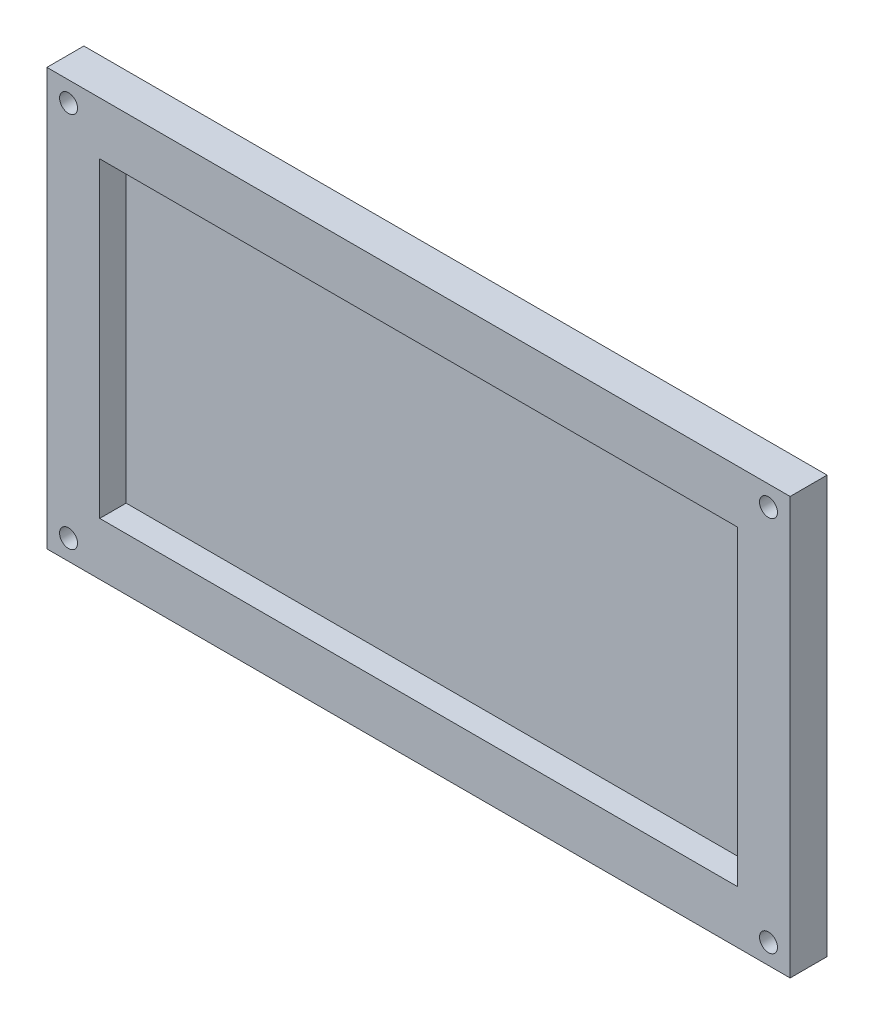
ISO-10303-21;
HEADER;
FILE_DESCRIPTION(('STEP AP214'),'2;1');
FILE_NAME('part.step','',(''),(''),'','','');
FILE_SCHEMA(('AUTOMOTIVE_DESIGN { 1 0 10303 214 1 1 1 1 }'));
ENDSEC;
DATA;
#1=APPLICATION_CONTEXT('core data for automotive mechanical design processes');
#2=APPLICATION_PROTOCOL_DEFINITION('international standard','automotive_design',2000,#1);
#3=PRODUCT_CONTEXT('',#1,'mechanical');
#4=PRODUCT('Part','Part','',(#3));
#5=PRODUCT_RELATED_PRODUCT_CATEGORY('part','',(#4));
#6=PRODUCT_DEFINITION_FORMATION('','',#4);
#7=PRODUCT_DEFINITION_CONTEXT('part definition',#1,'design');
#8=PRODUCT_DEFINITION('design','',#6,#7);
#9=PRODUCT_DEFINITION_SHAPE('','',#8);
#10=(LENGTH_UNIT() NAMED_UNIT(*) SI_UNIT(.MILLI.,.METRE.));
#11=(NAMED_UNIT(*) PLANE_ANGLE_UNIT() SI_UNIT($,.RADIAN.));
#12=(NAMED_UNIT(*) SI_UNIT($,.STERADIAN.) SOLID_ANGLE_UNIT());
#13=UNCERTAINTY_MEASURE_WITH_UNIT(LENGTH_MEASURE(1.E-05),#10,'distance_accuracy_value','');
#14=(GEOMETRIC_REPRESENTATION_CONTEXT(3) GLOBAL_UNCERTAINTY_ASSIGNED_CONTEXT((#13)) GLOBAL_UNIT_ASSIGNED_CONTEXT((#10,
#11,#12)) REPRESENTATION_CONTEXT('',''));
#15=CARTESIAN_POINT('',(0.,0.,0.));
#16=DIRECTION('',(0.,0.,1.));
#17=DIRECTION('',(1.,0.,0.));
#18=AXIS2_PLACEMENT_3D('',#15,#16,#17);
#19=CARTESIAN_POINT('',(0.,0.,7.));
#20=DIRECTION('',(0.,0.,1.));
#21=DIRECTION('',(1.,0.,0.));
#22=AXIS2_PLACEMENT_3D('',#19,#20,#21);
#23=PLANE('',#22);
#24=DIRECTION('',(0.,-1.,0.));
#25=VECTOR('',#24,1.);
#26=CARTESIAN_POINT('',(-60.35,29.475,7.));
#27=LINE('',#26,#25);
#28=CARTESIAN_POINT('',(-60.35,29.475,7.));
#29=VERTEX_POINT('',#28);
#30=CARTESIAN_POINT('',(-60.35,-29.475,7.));
#31=VERTEX_POINT('',#30);
#32=EDGE_CURVE('E56',#29,#31,#27,.T.);
#33=ORIENTED_EDGE('',*,*,#32,.F.);
#34=DIRECTION('',(-1.,0.,0.));
#35=VECTOR('',#34,1.);
#36=CARTESIAN_POINT('',(-60.35,29.475,7.));
#37=LINE('',#36,#35);
#38=CARTESIAN_POINT('',(60.35,29.475,7.));
#39=VERTEX_POINT('',#38);
#40=EDGE_CURVE('E135',#39,#29,#37,.T.);
#41=ORIENTED_EDGE('',*,*,#40,.F.);
#42=DIRECTION('',(0.,1.,0.));
#43=VECTOR('',#42,1.);
#44=CARTESIAN_POINT('',(60.35,29.475,7.));
#45=LINE('',#44,#43);
#46=CARTESIAN_POINT('',(60.35,-29.475,7.));
#47=VERTEX_POINT('',#46);
#48=EDGE_CURVE('E138',#47,#39,#45,.T.);
#49=ORIENTED_EDGE('',*,*,#48,.F.);
#50=DIRECTION('',(1.,0.,0.));
#51=VECTOR('',#50,1.);
#52=CARTESIAN_POINT('',(-60.35,-29.475,7.));
#53=LINE('',#52,#51);
#54=EDGE_CURVE('E144',#31,#47,#53,.T.);
#55=ORIENTED_EDGE('',*,*,#54,.F.);
#56=EDGE_LOOP('',(#33,#41,#49,#55));
#57=FACE_BOUND('',#56,.T.);
#58=CARTESIAN_POINT('',(66.2527237899999,-35.6682686500001,7.));
#59=DIRECTION('',(0.,0.,1.));
#60=DIRECTION('',(1.,0.,0.));
#61=AXIS2_PLACEMENT_3D('',#58,#59,#60);
#62=CIRCLE('',#61,1.69999999999999);
#63=CARTESIAN_POINT('',(67.9527237899999,-35.6682686500001,7.));
#64=VERTEX_POINT('',#63);
#65=EDGE_CURVE('E160',#64,#64,#62,.T.);
#66=ORIENTED_EDGE('',*,*,#65,.F.);
#67=EDGE_LOOP('',(#66));
#68=FACE_BOUND('',#67,.T.);
#69=CARTESIAN_POINT('',(-66.25272379,35.66826865,7.));
#70=DIRECTION('',(0.,0.,1.));
#71=DIRECTION('',(1.,0.,0.));
#72=AXIS2_PLACEMENT_3D('',#69,#70,#71);
#73=CIRCLE('',#72,1.7);
#74=CARTESIAN_POINT('',(-64.55272379,35.66826865,7.));
#75=VERTEX_POINT('',#74);
#76=EDGE_CURVE('E172',#75,#75,#73,.T.);
#77=ORIENTED_EDGE('',*,*,#76,.F.);
#78=EDGE_LOOP('',(#77));
#79=FACE_BOUND('',#78,.T.);
#80=DIRECTION('',(0.,1.,0.));
#81=VECTOR('',#80,1.);
#82=CARTESIAN_POINT('',(70.35,39.475,7.));
#83=LINE('',#82,#81);
#84=CARTESIAN_POINT('',(70.35,-39.475,7.));
#85=VERTEX_POINT('',#84);
#86=CARTESIAN_POINT('',(70.35,39.475,7.));
#87=VERTEX_POINT('',#86);
#88=EDGE_CURVE('E178',#85,#87,#83,.T.);
#89=ORIENTED_EDGE('',*,*,#88,.T.);
#90=DIRECTION('',(-1.,0.,0.));
#91=VECTOR('',#90,1.);
#92=CARTESIAN_POINT('',(-70.35,39.475,7.));
#93=LINE('',#92,#91);
#94=CARTESIAN_POINT('',(-70.35,39.475,7.));
#95=VERTEX_POINT('',#94);
#96=EDGE_CURVE('E93',#87,#95,#93,.T.);
#97=ORIENTED_EDGE('',*,*,#96,.T.);
#98=DIRECTION('',(0.,-1.,0.));
#99=VECTOR('',#98,1.);
#100=CARTESIAN_POINT('',(-70.35,39.475,7.));
#101=LINE('',#100,#99);
#102=CARTESIAN_POINT('',(-70.35,-39.475,7.));
#103=VERTEX_POINT('',#102);
#104=EDGE_CURVE('E181',#95,#103,#101,.T.);
#105=ORIENTED_EDGE('',*,*,#104,.T.);
#106=DIRECTION('',(1.,0.,0.));
#107=VECTOR('',#106,1.);
#108=CARTESIAN_POINT('',(-70.35,-39.475,7.));
#109=LINE('',#108,#107);
#110=EDGE_CURVE('E65',#103,#85,#109,.T.);
#111=ORIENTED_EDGE('',*,*,#110,.T.);
#112=EDGE_LOOP('',(#89,#97,#105,#111));
#113=FACE_BOUND('',#112,.T.);
#114=CARTESIAN_POINT('',(66.2527237899999,35.6682686500001,7.));
#115=DIRECTION('',(0.,0.,1.));
#116=DIRECTION('',(-1.,0.,0.));
#117=AXIS2_PLACEMENT_3D('',#114,#115,#116);
#118=CIRCLE('',#117,1.69999999999999);
#119=CARTESIAN_POINT('',(64.5527237899999,35.6682686500001,7.));
#120=VERTEX_POINT('',#119);
#121=EDGE_CURVE('E166',#120,#120,#118,.T.);
#122=ORIENTED_EDGE('',*,*,#121,.F.);
#123=EDGE_LOOP('',(#122));
#124=FACE_BOUND('',#123,.T.);
#125=CARTESIAN_POINT('',(-66.25272379,-35.66826865,7.));
#126=DIRECTION('',(0.,0.,1.));
#127=DIRECTION('',(-1.,0.,0.));
#128=AXIS2_PLACEMENT_3D('',#125,#126,#127);
#129=CIRCLE('',#128,1.7);
#130=CARTESIAN_POINT('',(-67.95272379,-35.66826865,7.));
#131=VERTEX_POINT('',#130);
#132=EDGE_CURVE('E154',#131,#131,#129,.T.);
#133=ORIENTED_EDGE('',*,*,#132,.F.);
#134=EDGE_LOOP('',(#133));
#135=FACE_BOUND('',#134,.T.);
#136=ADVANCED_FACE('F41',(#57,#68,#79,#113,#124,#135),#23,.T.);
#137=CARTESIAN_POINT('',(0.,0.,0.));
#138=DIRECTION('',(0.,0.,1.));
#139=DIRECTION('',(1.,0.,0.));
#140=AXIS2_PLACEMENT_3D('',#137,#138,#139);
#141=PLANE('',#140);
#142=DIRECTION('',(0.,1.,0.));
#143=VECTOR('',#142,1.);
#144=CARTESIAN_POINT('',(70.35,39.475,0.));
#145=LINE('',#144,#143);
#146=CARTESIAN_POINT('',(70.35,-39.475,0.));
#147=VERTEX_POINT('',#146);
#148=CARTESIAN_POINT('',(70.35,39.475,0.));
#149=VERTEX_POINT('',#148);
#150=EDGE_CURVE('E175',#147,#149,#145,.T.);
#151=ORIENTED_EDGE('',*,*,#150,.F.);
#152=DIRECTION('',(1.,0.,0.));
#153=VECTOR('',#152,1.);
#154=CARTESIAN_POINT('',(-70.35,-39.475,0.));
#155=LINE('',#154,#153);
#156=CARTESIAN_POINT('',(-70.35,-39.475,0.));
#157=VERTEX_POINT('',#156);
#158=EDGE_CURVE('E86',#157,#147,#155,.T.);
#159=ORIENTED_EDGE('',*,*,#158,.F.);
#160=DIRECTION('',(0.,-1.,0.));
#161=VECTOR('',#160,1.);
#162=CARTESIAN_POINT('',(-70.35,39.475,0.));
#163=LINE('',#162,#161);
#164=CARTESIAN_POINT('',(-70.35,39.475,0.));
#165=VERTEX_POINT('',#164);
#166=EDGE_CURVE('E189',#165,#157,#163,.T.);
#167=ORIENTED_EDGE('',*,*,#166,.F.);
#168=DIRECTION('',(-1.,0.,0.));
#169=VECTOR('',#168,1.);
#170=CARTESIAN_POINT('',(-70.35,39.475,0.));
#171=LINE('',#170,#169);
#172=EDGE_CURVE('E187',#149,#165,#171,.T.);
#173=ORIENTED_EDGE('',*,*,#172,.F.);
#174=EDGE_LOOP('',(#151,#159,#167,#173));
#175=FACE_BOUND('',#174,.T.);
#176=CARTESIAN_POINT('',(-66.25272379,35.66826865,0.));
#177=DIRECTION('',(0.,0.,1.));
#178=DIRECTION('',(1.,0.,0.));
#179=AXIS2_PLACEMENT_3D('',#176,#177,#178);
#180=CIRCLE('',#179,1.7);
#181=CARTESIAN_POINT('',(-64.55272379,35.66826865,0.));
#182=VERTEX_POINT('',#181);
#183=EDGE_CURVE('E169',#182,#182,#180,.T.);
#184=ORIENTED_EDGE('',*,*,#183,.T.);
#185=EDGE_LOOP('',(#184));
#186=FACE_BOUND('',#185,.T.);
#187=CARTESIAN_POINT('',(66.2527237899999,35.6682686500001,0.));
#188=DIRECTION('',(0.,0.,1.));
#189=DIRECTION('',(-1.,0.,0.));
#190=AXIS2_PLACEMENT_3D('',#187,#188,#189);
#191=CIRCLE('',#190,1.69999999999999);
#192=CARTESIAN_POINT('',(64.5527237899999,35.6682686500001,0.));
#193=VERTEX_POINT('',#192);
#194=EDGE_CURVE('E163',#193,#193,#191,.T.);
#195=ORIENTED_EDGE('',*,*,#194,.T.);
#196=EDGE_LOOP('',(#195));
#197=FACE_BOUND('',#196,.T.);
#198=CARTESIAN_POINT('',(66.2527237899999,-35.6682686500001,0.));
#199=DIRECTION('',(0.,0.,1.));
#200=DIRECTION('',(1.,0.,0.));
#201=AXIS2_PLACEMENT_3D('',#198,#199,#200);
#202=CIRCLE('',#201,1.69999999999999);
#203=CARTESIAN_POINT('',(67.9527237899999,-35.6682686500001,0.));
#204=VERTEX_POINT('',#203);
#205=EDGE_CURVE('E157',#204,#204,#202,.T.);
#206=ORIENTED_EDGE('',*,*,#205,.T.);
#207=EDGE_LOOP('',(#206));
#208=FACE_BOUND('',#207,.T.);
#209=CARTESIAN_POINT('',(-66.25272379,-35.66826865,0.));
#210=DIRECTION('',(0.,0.,1.));
#211=DIRECTION('',(-1.,0.,0.));
#212=AXIS2_PLACEMENT_3D('',#209,#210,#211);
#213=CIRCLE('',#212,1.7);
#214=CARTESIAN_POINT('',(-67.95272379,-35.66826865,0.));
#215=VERTEX_POINT('',#214);
#216=EDGE_CURVE('E150',#215,#215,#213,.T.);
#217=ORIENTED_EDGE('',*,*,#216,.T.);
#218=EDGE_LOOP('',(#217));
#219=FACE_BOUND('',#218,.T.);
#220=ADVANCED_FACE('F202',(#175,#186,#197,#208,#219),#141,.F.);
#221=CARTESIAN_POINT('',(70.35,39.475,7.));
#222=DIRECTION('',(-1.,0.,0.));
#223=DIRECTION('',(0.,-1.,0.));
#224=AXIS2_PLACEMENT_3D('',#221,#222,#223);
#225=PLANE('',#224);
#226=ORIENTED_EDGE('',*,*,#150,.T.);
#227=DIRECTION('',(0.,0.,-1.));
#228=VECTOR('',#227,1.);
#229=CARTESIAN_POINT('',(70.35,39.475,7.));
#230=LINE('',#229,#228);
#231=EDGE_CURVE('E11',#87,#149,#230,.T.);
#232=ORIENTED_EDGE('',*,*,#231,.F.);
#233=ORIENTED_EDGE('',*,*,#88,.F.);
#234=DIRECTION('',(0.,0.,-1.));
#235=VECTOR('',#234,1.);
#236=CARTESIAN_POINT('',(70.35,-39.475,7.));
#237=LINE('',#236,#235);
#238=EDGE_CURVE('E184',#85,#147,#237,.T.);
#239=ORIENTED_EDGE('',*,*,#238,.T.);
#240=EDGE_LOOP('',(#226,#232,#233,#239));
#241=FACE_BOUND('',#240,.T.);
#242=ADVANCED_FACE('F43',(#241),#225,.F.);
#243=CARTESIAN_POINT('',(-70.35,39.475,7.));
#244=DIRECTION('',(0.,-1.,0.));
#245=DIRECTION('',(0.,0.,-1.));
#246=AXIS2_PLACEMENT_3D('',#243,#244,#245);
#247=PLANE('',#246);
#248=ORIENTED_EDGE('',*,*,#172,.T.);
#249=DIRECTION('',(0.,0.,-1.));
#250=VECTOR('',#249,1.);
#251=CARTESIAN_POINT('',(-70.35,39.475,7.));
#252=LINE('',#251,#250);
#253=EDGE_CURVE('E49',#95,#165,#252,.T.);
#254=ORIENTED_EDGE('',*,*,#253,.F.);
#255=ORIENTED_EDGE('',*,*,#96,.F.);
#256=ORIENTED_EDGE('',*,*,#231,.T.);
#257=EDGE_LOOP('',(#248,#254,#255,#256));
#258=FACE_BOUND('',#257,.T.);
#259=ADVANCED_FACE('F218',(#258),#247,.F.);
#260=CARTESIAN_POINT('',(-70.35,39.475,7.));
#261=DIRECTION('',(1.,0.,0.));
#262=DIRECTION('',(0.,0.,-1.));
#263=AXIS2_PLACEMENT_3D('',#260,#261,#262);
#264=PLANE('',#263);
#265=ORIENTED_EDGE('',*,*,#166,.T.);
#266=DIRECTION('',(0.,0.,-1.));
#267=VECTOR('',#266,1.);
#268=CARTESIAN_POINT('',(-70.35,-39.475,7.));
#269=LINE('',#268,#267);
#270=EDGE_CURVE('E193',#103,#157,#269,.T.);
#271=ORIENTED_EDGE('',*,*,#270,.F.);
#272=ORIENTED_EDGE('',*,*,#104,.F.);
#273=ORIENTED_EDGE('',*,*,#253,.T.);
#274=EDGE_LOOP('',(#265,#271,#272,#273));
#275=FACE_BOUND('',#274,.T.);
#276=ADVANCED_FACE('F198',(#275),#264,.F.);
#277=CARTESIAN_POINT('',(-70.35,-39.475,7.));
#278=DIRECTION('',(0.,1.,0.));
#279=DIRECTION('',(0.,0.,1.));
#280=AXIS2_PLACEMENT_3D('',#277,#278,#279);
#281=PLANE('',#280);
#282=ORIENTED_EDGE('',*,*,#158,.T.);
#283=ORIENTED_EDGE('',*,*,#238,.F.);
#284=ORIENTED_EDGE('',*,*,#110,.F.);
#285=ORIENTED_EDGE('',*,*,#270,.T.);
#286=EDGE_LOOP('',(#282,#283,#284,#285));
#287=FACE_BOUND('',#286,.T.);
#288=ADVANCED_FACE('F207',(#287),#281,.F.);
#289=CARTESIAN_POINT('',(-66.25272379,35.66826865,7.));
#290=DIRECTION('',(0.,0.,-1.));
#291=DIRECTION('',(-1.,0.,0.));
#292=AXIS2_PLACEMENT_3D('',#289,#290,#291);
#293=CYLINDRICAL_SURFACE('',#292,1.7);
#294=ORIENTED_EDGE('',*,*,#76,.T.);
#295=EDGE_LOOP('',(#294));
#296=FACE_BOUND('',#295,.T.);
#297=ORIENTED_EDGE('',*,*,#183,.F.);
#298=EDGE_LOOP('',(#297));
#299=FACE_BOUND('',#298,.T.);
#300=ADVANCED_FACE('F209',(#296,#299),#293,.F.);
#301=CARTESIAN_POINT('',(66.2527237899999,35.6682686500001,7.));
#302=DIRECTION('',(0.,0.,-1.));
#303=DIRECTION('',(-1.,0.,0.));
#304=AXIS2_PLACEMENT_3D('',#301,#302,#303);
#305=CYLINDRICAL_SURFACE('',#304,1.69999999999999);
#306=ORIENTED_EDGE('',*,*,#121,.T.);
#307=EDGE_LOOP('',(#306));
#308=FACE_BOUND('',#307,.T.);
#309=ORIENTED_EDGE('',*,*,#194,.F.);
#310=EDGE_LOOP('',(#309));
#311=FACE_BOUND('',#310,.T.);
#312=ADVANCED_FACE('F215',(#308,#311),#305,.F.);
#313=CARTESIAN_POINT('',(66.2527237899999,-35.6682686500001,7.));
#314=DIRECTION('',(0.,0.,-1.));
#315=DIRECTION('',(-1.,0.,0.));
#316=AXIS2_PLACEMENT_3D('',#313,#314,#315);
#317=CYLINDRICAL_SURFACE('',#316,1.69999999999999);
#318=ORIENTED_EDGE('',*,*,#65,.T.);
#319=EDGE_LOOP('',(#318));
#320=FACE_BOUND('',#319,.T.);
#321=ORIENTED_EDGE('',*,*,#205,.F.);
#322=EDGE_LOOP('',(#321));
#323=FACE_BOUND('',#322,.T.);
#324=ADVANCED_FACE('F233',(#320,#323),#317,.F.);
#325=CARTESIAN_POINT('',(-66.25272379,-35.66826865,7.));
#326=DIRECTION('',(0.,0.,-1.));
#327=DIRECTION('',(-1.,0.,0.));
#328=AXIS2_PLACEMENT_3D('',#325,#326,#327);
#329=CYLINDRICAL_SURFACE('',#328,1.7);
#330=ORIENTED_EDGE('',*,*,#132,.T.);
#331=EDGE_LOOP('',(#330));
#332=FACE_BOUND('',#331,.T.);
#333=ORIENTED_EDGE('',*,*,#216,.F.);
#334=EDGE_LOOP('',(#333));
#335=FACE_BOUND('',#334,.T.);
#336=ADVANCED_FACE('F237',(#332,#335),#329,.F.);
#337=CARTESIAN_POINT('',(-60.35,29.475,2.));
#338=DIRECTION('',(-1.,0.,0.));
#339=DIRECTION('',(0.,-1.,0.));
#340=AXIS2_PLACEMENT_3D('',#337,#338,#339);
#341=PLANE('',#340);
#342=ORIENTED_EDGE('',*,*,#32,.T.);
#343=DIRECTION('',(0.,0.,1.));
#344=VECTOR('',#343,1.);
#345=CARTESIAN_POINT('',(-60.35,-29.475,2.));
#346=LINE('',#345,#344);
#347=CARTESIAN_POINT('',(-60.35,-29.475,2.));
#348=VERTEX_POINT('',#347);
#349=EDGE_CURVE('E113',#348,#31,#346,.T.);
#350=ORIENTED_EDGE('',*,*,#349,.F.);
#351=DIRECTION('',(0.,-1.,0.));
#352=VECTOR('',#351,1.);
#353=CARTESIAN_POINT('',(-60.35,29.475,2.));
#354=LINE('',#353,#352);
#355=CARTESIAN_POINT('',(-60.35,29.475,2.));
#356=VERTEX_POINT('',#355);
#357=EDGE_CURVE('E117',#356,#348,#354,.T.);
#358=ORIENTED_EDGE('',*,*,#357,.F.);
#359=DIRECTION('',(0.,0.,1.));
#360=VECTOR('',#359,1.);
#361=CARTESIAN_POINT('',(-60.35,29.475,2.));
#362=LINE('',#361,#360);
#363=EDGE_CURVE('E148',#356,#29,#362,.T.);
#364=ORIENTED_EDGE('',*,*,#363,.T.);
#365=EDGE_LOOP('',(#342,#350,#358,#364));
#366=FACE_BOUND('',#365,.T.);
#367=ADVANCED_FACE('F115',(#366),#341,.F.);
#368=CARTESIAN_POINT('',(-60.35,29.475,2.));
#369=DIRECTION('',(0.,1.,0.));
#370=DIRECTION('',(0.,0.,1.));
#371=AXIS2_PLACEMENT_3D('',#368,#369,#370);
#372=PLANE('',#371);
#373=ORIENTED_EDGE('',*,*,#40,.T.);
#374=ORIENTED_EDGE('',*,*,#363,.F.);
#375=DIRECTION('',(-1.,0.,0.));
#376=VECTOR('',#375,1.);
#377=CARTESIAN_POINT('',(-60.35,29.475,2.));
#378=LINE('',#377,#376);
#379=CARTESIAN_POINT('',(60.35,29.475,2.));
#380=VERTEX_POINT('',#379);
#381=EDGE_CURVE('E123',#380,#356,#378,.T.);
#382=ORIENTED_EDGE('',*,*,#381,.F.);
#383=DIRECTION('',(0.,0.,1.));
#384=VECTOR('',#383,1.);
#385=CARTESIAN_POINT('',(60.35,29.475,2.));
#386=LINE('',#385,#384);
#387=EDGE_CURVE('E151',#380,#39,#386,.T.);
#388=ORIENTED_EDGE('',*,*,#387,.T.);
#389=EDGE_LOOP('',(#373,#374,#382,#388));
#390=FACE_BOUND('',#389,.T.);
#391=ADVANCED_FACE('F242',(#390),#372,.F.);
#392=CARTESIAN_POINT('',(60.35,29.475,2.));
#393=DIRECTION('',(1.,0.,0.));
#394=DIRECTION('',(0.,0.,-1.));
#395=AXIS2_PLACEMENT_3D('',#392,#393,#394);
#396=PLANE('',#395);
#397=ORIENTED_EDGE('',*,*,#48,.T.);
#398=ORIENTED_EDGE('',*,*,#387,.F.);
#399=DIRECTION('',(0.,1.,0.));
#400=VECTOR('',#399,1.);
#401=CARTESIAN_POINT('',(60.35,29.475,2.));
#402=LINE('',#401,#400);
#403=CARTESIAN_POINT('',(60.35,-29.475,2.));
#404=VERTEX_POINT('',#403);
#405=EDGE_CURVE('E131',#404,#380,#402,.T.);
#406=ORIENTED_EDGE('',*,*,#405,.F.);
#407=DIRECTION('',(0.,0.,1.));
#408=VECTOR('',#407,1.);
#409=CARTESIAN_POINT('',(60.35,-29.475,2.));
#410=LINE('',#409,#408);
#411=EDGE_CURVE('E122',#404,#47,#410,.T.);
#412=ORIENTED_EDGE('',*,*,#411,.T.);
#413=EDGE_LOOP('',(#397,#398,#406,#412));
#414=FACE_BOUND('',#413,.T.);
#415=ADVANCED_FACE('F245',(#414),#396,.F.);
#416=CARTESIAN_POINT('',(-60.35,-29.475,2.));
#417=DIRECTION('',(0.,-1.,0.));
#418=DIRECTION('',(0.,0.,-1.));
#419=AXIS2_PLACEMENT_3D('',#416,#417,#418);
#420=PLANE('',#419);
#421=ORIENTED_EDGE('',*,*,#54,.T.);
#422=ORIENTED_EDGE('',*,*,#411,.F.);
#423=DIRECTION('',(1.,0.,0.));
#424=VECTOR('',#423,1.);
#425=CARTESIAN_POINT('',(-60.35,-29.475,2.));
#426=LINE('',#425,#424);
#427=EDGE_CURVE('E126',#348,#404,#426,.T.);
#428=ORIENTED_EDGE('',*,*,#427,.F.);
#429=ORIENTED_EDGE('',*,*,#349,.T.);
#430=EDGE_LOOP('',(#421,#422,#428,#429));
#431=FACE_BOUND('',#430,.T.);
#432=ADVANCED_FACE('F127',(#431),#420,.F.);
#433=CARTESIAN_POINT('',(0.,0.,2.));
#434=DIRECTION('',(0.,0.,1.));
#435=DIRECTION('',(1.,0.,0.));
#436=AXIS2_PLACEMENT_3D('',#433,#434,#435);
#437=PLANE('',#436);
#438=ORIENTED_EDGE('',*,*,#357,.T.);
#439=ORIENTED_EDGE('',*,*,#427,.T.);
#440=ORIENTED_EDGE('',*,*,#405,.T.);
#441=ORIENTED_EDGE('',*,*,#381,.T.);
#442=EDGE_LOOP('',(#438,#439,#440,#441));
#443=FACE_BOUND('',#442,.T.);
#444=ADVANCED_FACE('F133',(#443),#437,.T.);
#445=CLOSED_SHELL('',(#136,#220,#242,#259,#276,#288,#300,#312,#324,#336,#367,#391,#415,#432,#444));
#446=MANIFOLD_SOLID_BREP('B2',#445);
#447=ADVANCED_BREP_SHAPE_REPRESENTATION('',(#18,#446),#14);
#448=SHAPE_DEFINITION_REPRESENTATION(#9,#447);
ENDSEC;
END-ISO-10303-21;
